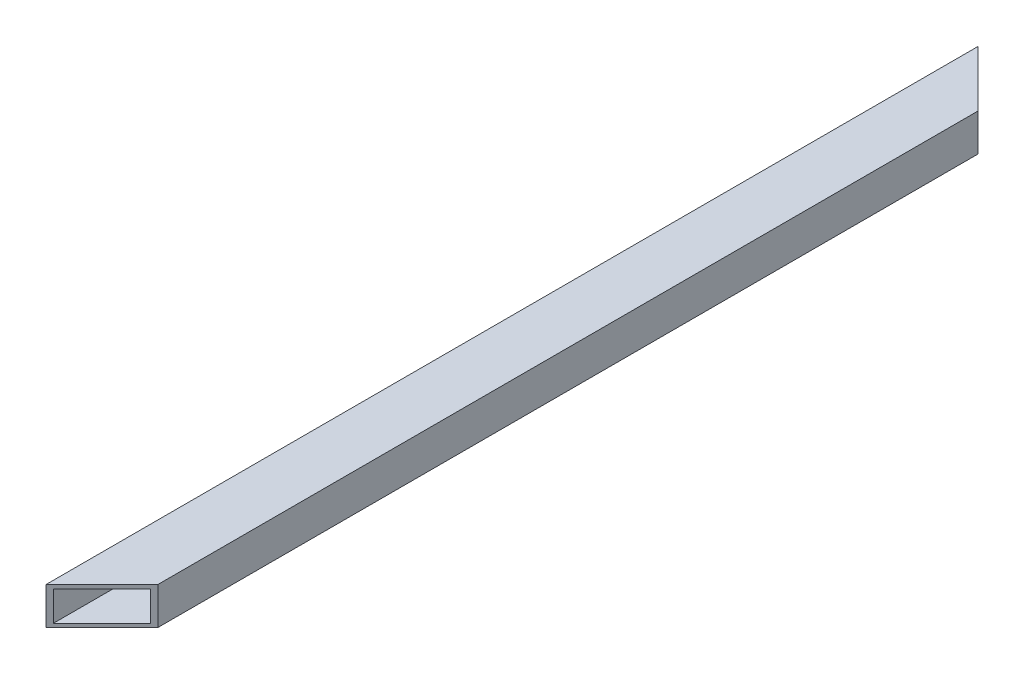
ISO-10303-21;
HEADER;
FILE_DESCRIPTION(('STEP AP214'),'2;1');
FILE_NAME('part.step','',(''),(''),'','','');
FILE_SCHEMA(('AUTOMOTIVE_DESIGN { 1 0 10303 214 1 1 1 1 }'));
ENDSEC;
DATA;
#1=APPLICATION_CONTEXT('core data for automotive mechanical design processes');
#2=APPLICATION_PROTOCOL_DEFINITION('international standard','automotive_design',2000,#1);
#3=PRODUCT_CONTEXT('',#1,'mechanical');
#4=PRODUCT('Part','Part','',(#3));
#5=PRODUCT_RELATED_PRODUCT_CATEGORY('part','',(#4));
#6=PRODUCT_DEFINITION_FORMATION('','',#4);
#7=PRODUCT_DEFINITION_CONTEXT('part definition',#1,'design');
#8=PRODUCT_DEFINITION('design','',#6,#7);
#9=PRODUCT_DEFINITION_SHAPE('','',#8);
#10=(LENGTH_UNIT() NAMED_UNIT(*) SI_UNIT(.MILLI.,.METRE.));
#11=(NAMED_UNIT(*) PLANE_ANGLE_UNIT() SI_UNIT($,.RADIAN.));
#12=(NAMED_UNIT(*) SI_UNIT($,.STERADIAN.) SOLID_ANGLE_UNIT());
#13=UNCERTAINTY_MEASURE_WITH_UNIT(LENGTH_MEASURE(1.E-05),#10,'distance_accuracy_value','');
#14=(GEOMETRIC_REPRESENTATION_CONTEXT(3) GLOBAL_UNCERTAINTY_ASSIGNED_CONTEXT((#13)) GLOBAL_UNIT_ASSIGNED_CONTEXT((#10,
#11,#12)) REPRESENTATION_CONTEXT('',''));
#15=CARTESIAN_POINT('',(0.,0.,0.));
#16=DIRECTION('',(0.,0.,1.));
#17=DIRECTION('',(1.,0.,0.));
#18=AXIS2_PLACEMENT_3D('',#15,#16,#17);
#19=CARTESIAN_POINT('',(13.,8.,500.));
#20=DIRECTION('',(0.,-1.,0.));
#21=DIRECTION('',(0.,0.,-1.));
#22=AXIS2_PLACEMENT_3D('',#19,#20,#21);
#23=PLANE('',#22);
#24=DIRECTION('',(-0.707106781186552,0.,-0.707106781186543));
#25=VECTOR('',#24,1.);
#26=CARTESIAN_POINT('',(249.,8.,263.999999999997));
#27=LINE('',#26,#25);
#28=CARTESIAN_POINT('',(13.,8.,27.9999999999997));
#29=VERTEX_POINT('',#28);
#30=CARTESIAN_POINT('',(-13.,8.,1.99999999999995));
#31=VERTEX_POINT('',#30);
#32=EDGE_CURVE('E11',#29,#31,#27,.T.);
#33=ORIENTED_EDGE('',*,*,#32,.F.);
#34=DIRECTION('',(0.,0.,-1.));
#35=VECTOR('',#34,1.);
#36=CARTESIAN_POINT('',(13.,8.,500.));
#37=LINE('',#36,#35);
#38=CARTESIAN_POINT('',(13.,8.,472.));
#39=VERTEX_POINT('',#38);
#40=EDGE_CURVE('E162',#39,#29,#37,.T.);
#41=ORIENTED_EDGE('',*,*,#40,.F.);
#42=DIRECTION('',(0.707106781186551,0.,-0.707106781186544));
#43=VECTOR('',#42,1.);
#44=CARTESIAN_POINT('',(-0.999999999999857,8.,486.));
#45=LINE('',#44,#43);
#46=CARTESIAN_POINT('',(-13.,8.,498.));
#47=VERTEX_POINT('',#46);
#48=EDGE_CURVE('E48',#47,#39,#45,.T.);
#49=ORIENTED_EDGE('',*,*,#48,.F.);
#50=DIRECTION('',(0.,0.,-1.));
#51=VECTOR('',#50,1.);
#52=CARTESIAN_POINT('',(-13.,8.,500.));
#53=LINE('',#52,#51);
#54=EDGE_CURVE('E169',#47,#31,#53,.T.);
#55=ORIENTED_EDGE('',*,*,#54,.T.);
#56=EDGE_LOOP('',(#33,#41,#49,#55));
#57=FACE_BOUND('',#56,.T.);
#58=ADVANCED_FACE('F39',(#57),#23,.T.);
#59=CARTESIAN_POINT('',(13.,-8.,500.));
#60=DIRECTION('',(-1.,0.,0.));
#61=DIRECTION('',(0.,0.,1.));
#62=AXIS2_PLACEMENT_3D('',#59,#60,#61);
#63=PLANE('',#62);
#64=DIRECTION('',(0.,1.,0.));
#65=VECTOR('',#64,1.);
#66=CARTESIAN_POINT('',(13.,-7.99999999999991,27.9999999999996));
#67=LINE('',#66,#65);
#68=CARTESIAN_POINT('',(13.,-8.,27.9999999999996));
#69=VERTEX_POINT('',#68);
#70=EDGE_CURVE('E182',#69,#29,#67,.T.);
#71=ORIENTED_EDGE('',*,*,#70,.F.);
#72=DIRECTION('',(0.,0.,-1.));
#73=VECTOR('',#72,1.);
#74=CARTESIAN_POINT('',(13.,-8.,500.));
#75=LINE('',#74,#73);
#76=CARTESIAN_POINT('',(13.,-8.,472.));
#77=VERTEX_POINT('',#76);
#78=EDGE_CURVE('E138',#77,#69,#75,.T.);
#79=ORIENTED_EDGE('',*,*,#78,.F.);
#80=DIRECTION('',(0.,-1.,0.));
#81=VECTOR('',#80,1.);
#82=CARTESIAN_POINT('',(13.,-8.,472.));
#83=LINE('',#82,#81);
#84=EDGE_CURVE('E151',#39,#77,#83,.T.);
#85=ORIENTED_EDGE('',*,*,#84,.F.);
#86=ORIENTED_EDGE('',*,*,#40,.T.);
#87=EDGE_LOOP('',(#71,#79,#85,#86));
#88=FACE_BOUND('',#87,.T.);
#89=ADVANCED_FACE('F161',(#88),#63,.T.);
#90=CARTESIAN_POINT('',(13.,-8.,500.));
#91=DIRECTION('',(0.,1.,0.));
#92=DIRECTION('',(-1.,0.,0.));
#93=AXIS2_PLACEMENT_3D('',#90,#91,#92);
#94=PLANE('',#93);
#95=DIRECTION('',(0.707106781186552,0.,0.707106781186543));
#96=VECTOR('',#95,1.);
#97=CARTESIAN_POINT('',(249.,-7.99999999999997,263.999999999997));
#98=LINE('',#97,#96);
#99=CARTESIAN_POINT('',(-13.,-8.,1.99999999999995));
#100=VERTEX_POINT('',#99);
#101=EDGE_CURVE('E179',#100,#69,#98,.T.);
#102=ORIENTED_EDGE('',*,*,#101,.F.);
#103=DIRECTION('',(0.,0.,-1.));
#104=VECTOR('',#103,1.);
#105=CARTESIAN_POINT('',(-13.,-8.,500.));
#106=LINE('',#105,#104);
#107=CARTESIAN_POINT('',(-13.,-8.,498.));
#108=VERTEX_POINT('',#107);
#109=EDGE_CURVE('E132',#108,#100,#106,.T.);
#110=ORIENTED_EDGE('',*,*,#109,.F.);
#111=DIRECTION('',(-0.707106781186551,0.,0.707106781186544));
#112=VECTOR('',#111,1.);
#113=CARTESIAN_POINT('',(-0.999999999999855,-8.,486.));
#114=LINE('',#113,#112);
#115=EDGE_CURVE('E165',#77,#108,#114,.T.);
#116=ORIENTED_EDGE('',*,*,#115,.F.);
#117=ORIENTED_EDGE('',*,*,#78,.T.);
#118=EDGE_LOOP('',(#102,#110,#116,#117));
#119=FACE_BOUND('',#118,.T.);
#120=ADVANCED_FACE('F213',(#119),#94,.T.);
#121=CARTESIAN_POINT('',(-13.,-8.,500.));
#122=DIRECTION('',(1.,0.,0.));
#123=DIRECTION('',(0.,0.,-1.));
#124=AXIS2_PLACEMENT_3D('',#121,#122,#123);
#125=PLANE('',#124);
#126=DIRECTION('',(0.,-1.,0.));
#127=VECTOR('',#126,1.);
#128=CARTESIAN_POINT('',(-13.,-7.99999999999991,2.));
#129=LINE('',#128,#127);
#130=EDGE_CURVE('E174',#31,#100,#129,.T.);
#131=ORIENTED_EDGE('',*,*,#130,.F.);
#132=ORIENTED_EDGE('',*,*,#54,.F.);
#133=DIRECTION('',(0.,1.,0.));
#134=VECTOR('',#133,1.);
#135=CARTESIAN_POINT('',(-13.,-8.,498.));
#136=LINE('',#135,#134);
#137=EDGE_CURVE('E63',#108,#47,#136,.T.);
#138=ORIENTED_EDGE('',*,*,#137,.F.);
#139=ORIENTED_EDGE('',*,*,#109,.T.);
#140=EDGE_LOOP('',(#131,#132,#138,#139));
#141=FACE_BOUND('',#140,.T.);
#142=ADVANCED_FACE('F205',(#141),#125,.T.);
#143=CARTESIAN_POINT('',(-15.,-10.,500.));
#144=DIRECTION('',(-0.707106781186544,0.,-0.707106781186551));
#145=DIRECTION('',(-0.707106781186551,0.,0.707106781186544));
#146=AXIS2_PLACEMENT_3D('',#143,#144,#145);
#147=PLANE('',#146);
#148=ORIENTED_EDGE('',*,*,#137,.T.);
#149=ORIENTED_EDGE('',*,*,#48,.T.);
#150=ORIENTED_EDGE('',*,*,#84,.T.);
#151=ORIENTED_EDGE('',*,*,#115,.T.);
#152=EDGE_LOOP('',(#148,#149,#150,#151));
#153=FACE_BOUND('',#152,.T.);
#154=DIRECTION('',(-0.707106781186551,0.,0.707106781186544));
#155=VECTOR('',#154,1.);
#156=CARTESIAN_POINT('',(-15.,10.,500.));
#157=LINE('',#156,#155);
#158=CARTESIAN_POINT('',(15.,10.,470.));
#159=VERTEX_POINT('',#158);
#160=CARTESIAN_POINT('',(-15.,10.,500.));
#161=VERTEX_POINT('',#160);
#162=EDGE_CURVE('E191',#159,#161,#157,.T.);
#163=ORIENTED_EDGE('',*,*,#162,.T.);
#164=DIRECTION('',(0.,-1.,0.));
#165=VECTOR('',#164,1.);
#166=CARTESIAN_POINT('',(-15.,-10.,500.));
#167=LINE('',#166,#165);
#168=CARTESIAN_POINT('',(-15.,-10.,500.));
#169=VERTEX_POINT('',#168);
#170=EDGE_CURVE('E131',#161,#169,#167,.T.);
#171=ORIENTED_EDGE('',*,*,#170,.T.);
#172=DIRECTION('',(-0.707106781186551,0.,0.707106781186544));
#173=VECTOR('',#172,1.);
#174=CARTESIAN_POINT('',(-15.,-10.,500.));
#175=LINE('',#174,#173);
#176=CARTESIAN_POINT('',(15.,-10.,470.));
#177=VERTEX_POINT('',#176);
#178=EDGE_CURVE('E121',#177,#169,#175,.T.);
#179=ORIENTED_EDGE('',*,*,#178,.F.);
#180=DIRECTION('',(0.,1.,0.));
#181=VECTOR('',#180,1.);
#182=CARTESIAN_POINT('',(15.,-10.,470.));
#183=LINE('',#182,#181);
#184=EDGE_CURVE('E55',#177,#159,#183,.T.);
#185=ORIENTED_EDGE('',*,*,#184,.T.);
#186=EDGE_LOOP('',(#163,#171,#179,#185));
#187=FACE_BOUND('',#186,.T.);
#188=ADVANCED_FACE('F150',(#153,#187),#147,.F.);
#189=CARTESIAN_POINT('',(-15.,-10.,0.));
#190=DIRECTION('',(-0.707106781186543,0.,0.707106781186552));
#191=DIRECTION('',(0.707106781186552,0.,0.707106781186543));
#192=AXIS2_PLACEMENT_3D('',#189,#190,#191);
#193=PLANE('',#192);
#194=ORIENTED_EDGE('',*,*,#130,.T.);
#195=ORIENTED_EDGE('',*,*,#101,.T.);
#196=ORIENTED_EDGE('',*,*,#70,.T.);
#197=ORIENTED_EDGE('',*,*,#32,.T.);
#198=EDGE_LOOP('',(#194,#195,#196,#197));
#199=FACE_BOUND('',#198,.T.);
#200=DIRECTION('',(0.707106781186552,0.,0.707106781186543));
#201=VECTOR('',#200,1.);
#202=CARTESIAN_POINT('',(-15.,10.,0.));
#203=LINE('',#202,#201);
#204=CARTESIAN_POINT('',(-15.,10.,0.));
#205=VERTEX_POINT('',#204);
#206=CARTESIAN_POINT('',(15.,10.,29.9999999999996));
#207=VERTEX_POINT('',#206);
#208=EDGE_CURVE('E115',#205,#207,#203,.T.);
#209=ORIENTED_EDGE('',*,*,#208,.T.);
#210=DIRECTION('',(0.,1.,0.));
#211=VECTOR('',#210,1.);
#212=CARTESIAN_POINT('',(15.,-10.,29.9999999999996));
#213=LINE('',#212,#211);
#214=CARTESIAN_POINT('',(15.,-10.,29.9999999999996));
#215=VERTEX_POINT('',#214);
#216=EDGE_CURVE('E110',#215,#207,#213,.T.);
#217=ORIENTED_EDGE('',*,*,#216,.F.);
#218=DIRECTION('',(0.707106781186552,0.,0.707106781186543));
#219=VECTOR('',#218,1.);
#220=CARTESIAN_POINT('',(-15.,-10.,0.));
#221=LINE('',#220,#219);
#222=CARTESIAN_POINT('',(-15.,-10.,0.));
#223=VERTEX_POINT('',#222);
#224=EDGE_CURVE('E103',#223,#215,#221,.T.);
#225=ORIENTED_EDGE('',*,*,#224,.F.);
#226=DIRECTION('',(0.,-1.,0.));
#227=VECTOR('',#226,1.);
#228=CARTESIAN_POINT('',(-15.,-10.,0.));
#229=LINE('',#228,#227);
#230=EDGE_CURVE('E107',#205,#223,#229,.T.);
#231=ORIENTED_EDGE('',*,*,#230,.F.);
#232=EDGE_LOOP('',(#209,#217,#225,#231));
#233=FACE_BOUND('',#232,.T.);
#234=ADVANCED_FACE('F105',(#199,#233),#193,.F.);
#235=CARTESIAN_POINT('',(-15.,-10.,500.));
#236=DIRECTION('',(1.,0.,0.));
#237=DIRECTION('',(0.,0.,-1.));
#238=AXIS2_PLACEMENT_3D('',#235,#236,#237);
#239=PLANE('',#238);
#240=ORIENTED_EDGE('',*,*,#230,.T.);
#241=DIRECTION('',(0.,0.,-1.));
#242=VECTOR('',#241,1.);
#243=CARTESIAN_POINT('',(-15.,-10.,500.));
#244=LINE('',#243,#242);
#245=EDGE_CURVE('E119',#169,#223,#244,.T.);
#246=ORIENTED_EDGE('',*,*,#245,.F.);
#247=ORIENTED_EDGE('',*,*,#170,.F.);
#248=DIRECTION('',(0.,0.,-1.));
#249=VECTOR('',#248,1.);
#250=CARTESIAN_POINT('',(-15.,10.,500.));
#251=LINE('',#250,#249);
#252=EDGE_CURVE('E129',#161,#205,#251,.T.);
#253=ORIENTED_EDGE('',*,*,#252,.T.);
#254=EDGE_LOOP('',(#240,#246,#247,#253));
#255=FACE_BOUND('',#254,.T.);
#256=ADVANCED_FACE('F41',(#255),#239,.F.);
#257=CARTESIAN_POINT('',(15.,-9.99999999999999,500.));
#258=DIRECTION('',(0.,1.,0.));
#259=DIRECTION('',(-1.,0.,0.));
#260=AXIS2_PLACEMENT_3D('',#257,#258,#259);
#261=PLANE('',#260);
#262=ORIENTED_EDGE('',*,*,#245,.T.);
#263=ORIENTED_EDGE('',*,*,#224,.T.);
#264=DIRECTION('',(0.,0.,-1.));
#265=VECTOR('',#264,1.);
#266=CARTESIAN_POINT('',(15.,-9.99999999999999,500.));
#267=LINE('',#266,#265);
#268=EDGE_CURVE('E125',#177,#215,#267,.T.);
#269=ORIENTED_EDGE('',*,*,#268,.F.);
#270=ORIENTED_EDGE('',*,*,#178,.T.);
#271=EDGE_LOOP('',(#262,#263,#269,#270));
#272=FACE_BOUND('',#271,.T.);
#273=ADVANCED_FACE('F120',(#272),#261,.F.);
#274=CARTESIAN_POINT('',(15.,-9.99999999999999,500.));
#275=DIRECTION('',(-1.,0.,0.));
#276=DIRECTION('',(0.,-1.,0.));
#277=AXIS2_PLACEMENT_3D('',#274,#275,#276);
#278=PLANE('',#277);
#279=ORIENTED_EDGE('',*,*,#268,.T.);
#280=ORIENTED_EDGE('',*,*,#216,.T.);
#281=DIRECTION('',(0.,0.,-1.));
#282=VECTOR('',#281,1.);
#283=CARTESIAN_POINT('',(15.,10.,500.));
#284=LINE('',#283,#282);
#285=EDGE_CURVE('E143',#159,#207,#284,.T.);
#286=ORIENTED_EDGE('',*,*,#285,.F.);
#287=ORIENTED_EDGE('',*,*,#184,.F.);
#288=EDGE_LOOP('',(#279,#280,#286,#287));
#289=FACE_BOUND('',#288,.T.);
#290=ADVANCED_FACE('F202',(#289),#278,.F.);
#291=CARTESIAN_POINT('',(15.,10.,500.));
#292=DIRECTION('',(0.,-1.,0.));
#293=DIRECTION('',(1.,0.,0.));
#294=AXIS2_PLACEMENT_3D('',#291,#292,#293);
#295=PLANE('',#294);
#296=ORIENTED_EDGE('',*,*,#285,.T.);
#297=ORIENTED_EDGE('',*,*,#208,.F.);
#298=ORIENTED_EDGE('',*,*,#252,.F.);
#299=ORIENTED_EDGE('',*,*,#162,.F.);
#300=EDGE_LOOP('',(#296,#297,#298,#299));
#301=FACE_BOUND('',#300,.T.);
#302=ADVANCED_FACE('F203',(#301),#295,.F.);
#303=CLOSED_SHELL('',(#58,#89,#120,#142,#188,#234,#256,#273,#290,#302));
#304=MANIFOLD_SOLID_BREP('B2',#303);
#305=ADVANCED_BREP_SHAPE_REPRESENTATION('',(#18,#304),#14);
#306=SHAPE_DEFINITION_REPRESENTATION(#9,#305);
ENDSEC;
END-ISO-10303-21;
